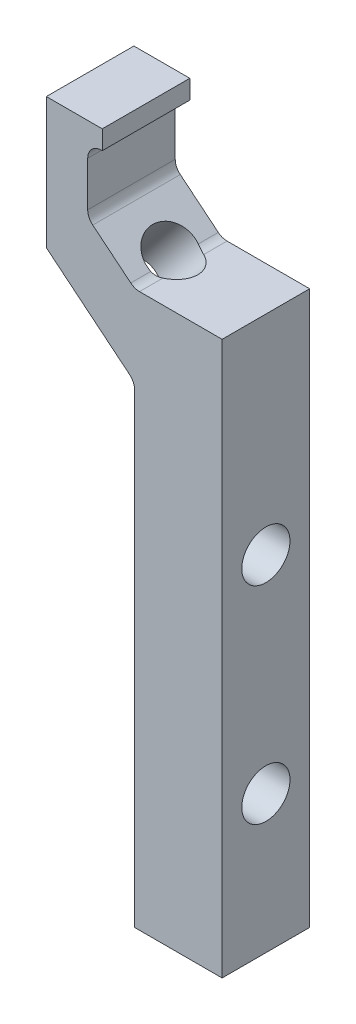
ISO-10303-21;
HEADER;
FILE_DESCRIPTION(('STEP AP214'),'2;1');
FILE_NAME('part.step','',(''),(''),'','','');
FILE_SCHEMA(('AUTOMOTIVE_DESIGN { 1 0 10303 214 1 1 1 1 }'));
ENDSEC;
DATA;
#1=APPLICATION_CONTEXT('core data for automotive mechanical design processes');
#2=APPLICATION_PROTOCOL_DEFINITION('international standard','automotive_design',2000,#1);
#3=PRODUCT_CONTEXT('',#1,'mechanical');
#4=PRODUCT('Part','Part','',(#3));
#5=PRODUCT_RELATED_PRODUCT_CATEGORY('part','',(#4));
#6=PRODUCT_DEFINITION_FORMATION('','',#4);
#7=PRODUCT_DEFINITION_CONTEXT('part definition',#1,'design');
#8=PRODUCT_DEFINITION('design','',#6,#7);
#9=PRODUCT_DEFINITION_SHAPE('','',#8);
#10=(LENGTH_UNIT() NAMED_UNIT(*) SI_UNIT(.MILLI.,.METRE.));
#11=(NAMED_UNIT(*) PLANE_ANGLE_UNIT() SI_UNIT($,.RADIAN.));
#12=(NAMED_UNIT(*) SI_UNIT($,.STERADIAN.) SOLID_ANGLE_UNIT());
#13=UNCERTAINTY_MEASURE_WITH_UNIT(LENGTH_MEASURE(1.E-05),#10,'distance_accuracy_value','');
#14=(GEOMETRIC_REPRESENTATION_CONTEXT(3) GLOBAL_UNCERTAINTY_ASSIGNED_CONTEXT((#13)) GLOBAL_UNIT_ASSIGNED_CONTEXT((#10,
#11,#12)) REPRESENTATION_CONTEXT('',''));
#15=CARTESIAN_POINT('',(0.,0.,0.));
#16=DIRECTION('',(0.,0.,1.));
#17=DIRECTION('',(1.,0.,0.));
#18=AXIS2_PLACEMENT_3D('',#15,#16,#17);
#19=CARTESIAN_POINT('',(-311.985474590838,82.2494022977564,12.7));
#20=DIRECTION('',(0.,0.,-1.));
#21=DIRECTION('',(-1.,0.,0.));
#22=AXIS2_PLACEMENT_3D('',#19,#20,#21);
#23=CYLINDRICAL_SURFACE('',#22,2.00000000000006);
#24=DIRECTION('',(0.,0.,-1.));
#25=VECTOR('',#24,1.);
#26=CARTESIAN_POINT('',(-313.252771845578,80.7021603424924,12.7));
#27=LINE('',#26,#25);
#28=CARTESIAN_POINT('',(-313.252771845578,80.7021603424922,2.90127585055652));
#29=VERTEX_POINT('',#28);
#30=CARTESIAN_POINT('',(-313.252771845578,80.7021603424924,0.));
#31=VERTEX_POINT('',#30);
#32=EDGE_CURVE('E247',#29,#31,#27,.T.);
#33=ORIENTED_EDGE('',*,*,#32,.F.);
#34=CARTESIAN_POINT('',(-313.252771845578,80.7021603424924,2.90127585055652));
#35=CARTESIAN_POINT('',(-313.21047379778,80.6675036747867,2.9107286558301));
#36=CARTESIAN_POINT('',(-313.166933552288,80.6347510794775,2.92150155180099));
#37=CARTESIAN_POINT('',(-313.077840684449,80.5731995785283,2.94551662128059));
#38=CARTESIAN_POINT('',(-313.032289738325,80.5443974588819,2.95875676656159));
#39=CARTESIAN_POINT('',(-312.939804176111,80.4909666793575,2.98748082182517));
#40=CARTESIAN_POINT('',(-312.89287744185,80.4663182437028,3.00295340887346));
#41=CARTESIAN_POINT('',(-312.797829766198,80.4210555644988,3.03597015881526));
#42=CARTESIAN_POINT('',(-312.749708644171,80.4004419354076,3.0535146365844));
#43=CARTESIAN_POINT('',(-312.60443888801,80.3447758912749,3.10877315240616));
#44=CARTESIAN_POINT('',(-312.505999579809,80.3156798355097,3.14923354542105));
#45=CARTESIAN_POINT('',(-312.308115917142,80.2730006489636,3.23534179277024));
#46=CARTESIAN_POINT('',(-312.208671595477,80.2594170135301,3.28098947829752));
#47=CARTESIAN_POINT('',(-312.088847324805,80.2519676119962,3.33791059609514));
#48=CARTESIAN_POINT('',(-312.068129838837,80.2510036260796,3.34782189679701));
#49=CARTESIAN_POINT('',(-312.026761118197,80.249721625733,3.36773496305563));
#50=CARTESIAN_POINT('',(-312.006109830682,80.2494025313598,3.37773654915213));
#51=CARTESIAN_POINT('',(-311.985474590838,80.2494022977563,3.38778280526414));
#52=B_SPLINE_CURVE_WITH_KNOTS('',3,(#34,#35,#36,#37,#38,#39,#40,#41,#42,#43,#44,#45,#46,#47,#48,
#49,#50,#51),.UNSPECIFIED.,.F.,.F.,(4,2,2,2,2,2,2,2,4),(0.,0.166394118839771,0.332652050327008,
0.498094576074735,0.663562277388514,0.99313956584748,1.32270613213646,1.39166154313553,
1.46050138456007),.UNSPECIFIED.);
#53=CARTESIAN_POINT('',(-311.985474590838,80.2494022977563,3.38778280526413));
#54=VERTEX_POINT('',#53);
#55=EDGE_CURVE('E50',#29,#54,#52,.T.);
#56=ORIENTED_EDGE('',*,*,#55,.T.);
#57=DIRECTION('',(0.,0.,-1.));
#58=VECTOR('',#57,1.);
#59=CARTESIAN_POINT('',(-311.985474590838,80.2494022977563,12.7));
#60=LINE('',#59,#58);
#61=CARTESIAN_POINT('',(-311.985474590838,80.2494022977563,0.));
#62=VERTEX_POINT('',#61);
#63=EDGE_CURVE('E251',#54,#62,#60,.T.);
#64=ORIENTED_EDGE('',*,*,#63,.T.);
#65=CARTESIAN_POINT('',(-311.985474590838,82.2494022977564,0.));
#66=DIRECTION('',(0.,0.,-1.));
#67=DIRECTION('',(-1.,0.,0.));
#68=AXIS2_PLACEMENT_3D('',#65,#66,#67);
#69=CIRCLE('',#68,2.00000000000006);
#70=EDGE_CURVE('E191',#62,#31,#69,.T.);
#71=ORIENTED_EDGE('',*,*,#70,.T.);
#72=EDGE_LOOP('',(#33,#56,#64,#71));
#73=FACE_BOUND('',#72,.T.);
#74=ADVANCED_FACE('F33',(#73),#23,.F.);
#75=CARTESIAN_POINT('',(-300.,0.,12.7));
#76=DIRECTION('',(-1.,0.,0.));
#77=DIRECTION('',(0.,0.,1.));
#78=AXIS2_PLACEMENT_3D('',#75,#76,#77);
#79=PLANE('',#78);
#80=CARTESIAN_POINT('',(-300.,50.,6.35));
#81=DIRECTION('',(-1.,0.,0.));
#82=DIRECTION('',(0.,0.,1.));
#83=AXIS2_PLACEMENT_3D('',#80,#81,#82);
#84=CIRCLE('',#83,3.5);
#85=CARTESIAN_POINT('',(-300.,50.,9.85));
#86=VERTEX_POINT('',#85);
#87=EDGE_CURVE('E255',#86,#86,#84,.T.);
#88=ORIENTED_EDGE('',*,*,#87,.T.);
#89=EDGE_LOOP('',(#88));
#90=FACE_BOUND('',#89,.T.);
#91=CARTESIAN_POINT('',(-300.,20.,6.35));
#92=DIRECTION('',(-1.,0.,0.));
#93=DIRECTION('',(0.,0.,1.));
#94=AXIS2_PLACEMENT_3D('',#91,#92,#93);
#95=CIRCLE('',#94,3.5);
#96=CARTESIAN_POINT('',(-300.,20.,9.85));
#97=VERTEX_POINT('',#96);
#98=EDGE_CURVE('E260',#97,#97,#95,.T.);
#99=ORIENTED_EDGE('',*,*,#98,.T.);
#100=EDGE_LOOP('',(#99));
#101=FACE_BOUND('',#100,.T.);
#102=DIRECTION('',(0.,1.,0.));
#103=VECTOR('',#102,1.);
#104=CARTESIAN_POINT('',(-300.,0.,0.));
#105=LINE('',#104,#103);
#106=CARTESIAN_POINT('',(-300.,0.,0.));
#107=VERTEX_POINT('',#106);
#108=CARTESIAN_POINT('',(-300.,80.2494022977564,0.));
#109=VERTEX_POINT('',#108);
#110=EDGE_CURVE('E185',#107,#109,#105,.T.);
#111=ORIENTED_EDGE('',*,*,#110,.T.);
#112=DIRECTION('',(0.,0.,-1.));
#113=VECTOR('',#112,1.);
#114=CARTESIAN_POINT('',(-300.,80.2494022977564,12.7));
#115=LINE('',#114,#113);
#116=CARTESIAN_POINT('',(-300.,80.2494022977564,12.7));
#117=VERTEX_POINT('',#116);
#118=EDGE_CURVE('E11',#117,#109,#115,.T.);
#119=ORIENTED_EDGE('',*,*,#118,.F.);
#120=DIRECTION('',(0.,1.,0.));
#121=VECTOR('',#120,1.);
#122=CARTESIAN_POINT('',(-300.,0.,12.7));
#123=LINE('',#122,#121);
#124=CARTESIAN_POINT('',(-300.,0.,12.7));
#125=VERTEX_POINT('',#124);
#126=EDGE_CURVE('E219',#125,#117,#123,.T.);
#127=ORIENTED_EDGE('',*,*,#126,.F.);
#128=DIRECTION('',(0.,0.,-1.));
#129=VECTOR('',#128,1.);
#130=CARTESIAN_POINT('',(-300.,0.,12.7));
#131=LINE('',#130,#129);
#132=EDGE_CURVE('E181',#125,#107,#131,.T.);
#133=ORIENTED_EDGE('',*,*,#132,.T.);
#134=EDGE_LOOP('',(#111,#119,#127,#133));
#135=FACE_BOUND('',#134,.T.);
#136=ADVANCED_FACE('F35',(#90,#101,#135),#79,.F.);
#137=CARTESIAN_POINT('',(-311.985474590838,80.2494022977563,12.7));
#138=DIRECTION('',(0.,-1.,0.));
#139=DIRECTION('',(1.,0.,0.));
#140=AXIS2_PLACEMENT_3D('',#137,#138,#139);
#141=PLANE('',#140);
#142=ORIENTED_EDGE('',*,*,#63,.F.);
#143=CARTESIAN_POINT('',(-314.395191325855,80.2494022977563,6.35));
#144=DIRECTION('',(0.,-1.,0.));
#145=DIRECTION('',(-1.,0.,0.));
#146=AXIS2_PLACEMENT_3D('',#143,#144,#145);
#147=ELLIPSE('',#146,4.52417928313357,3.49999999999997);
#148=CARTESIAN_POINT('',(-311.985474590838,80.2494022977563,9.31221719473586));
#149=VERTEX_POINT('',#148);
#150=EDGE_CURVE('E265',#54,#149,#147,.T.);
#151=ORIENTED_EDGE('',*,*,#150,.T.);
#152=CARTESIAN_POINT('',(-311.985474590838,80.2494022977563,12.7));
#153=VERTEX_POINT('',#152);
#154=EDGE_CURVE('E42',#153,#149,#60,.T.);
#155=ORIENTED_EDGE('',*,*,#154,.F.);
#156=DIRECTION('',(-1.,0.,0.));
#157=VECTOR('',#156,1.);
#158=CARTESIAN_POINT('',(-311.985474590838,80.2494022977563,12.7));
#159=LINE('',#158,#157);
#160=EDGE_CURVE('E121',#117,#153,#159,.T.);
#161=ORIENTED_EDGE('',*,*,#160,.F.);
#162=ORIENTED_EDGE('',*,*,#118,.T.);
#163=DIRECTION('',(-1.,0.,0.));
#164=VECTOR('',#163,1.);
#165=CARTESIAN_POINT('',(-311.985474590838,80.2494022977563,0.));
#166=LINE('',#165,#164);
#167=EDGE_CURVE('E188',#109,#62,#166,.T.);
#168=ORIENTED_EDGE('',*,*,#167,.T.);
#169=EDGE_LOOP('',(#142,#151,#155,#161,#162,#168));
#170=FACE_BOUND('',#169,.T.);
#171=ADVANCED_FACE('F309',(#170),#141,.F.);
#172=ORIENTED_EDGE('',*,*,#154,.T.);
#173=CARTESIAN_POINT('',(-311.985474590838,80.2494022977563,9.31221719473586));
#174=CARTESIAN_POINT('',(-312.041345873165,80.2494147062884,9.33942193889383));
#175=CARTESIAN_POINT('',(-312.097346264366,80.2517459726687,9.36629428141184));
#176=CARTESIAN_POINT('',(-312.209474534102,80.2611847807516,9.41901463518755));
#177=CARTESIAN_POINT('',(-312.265602476341,80.2682958585293,9.44486187307646));
#178=CARTESIAN_POINT('',(-312.430312393308,80.2963972499135,9.51867734425083));
#179=CARTESIAN_POINT('',(-312.538775362348,80.3241489948017,9.56468494702035));
#180=CARTESIAN_POINT('',(-312.698238094315,80.3798813014685,9.62719653256676));
#181=CARTESIAN_POINT('',(-312.750612777069,80.4006780233543,9.64687221529022));
#182=CARTESIAN_POINT('',(-312.854103169602,80.4469889194061,9.68388686690297));
#183=CARTESIAN_POINT('',(-312.905219096785,80.4725022723798,9.70122624164963));
#184=CARTESIAN_POINT('',(-313.007241934892,80.5290841931396,9.73376998464595));
#185=CARTESIAN_POINT('',(-313.05809384573,80.5602997436646,9.74889207741884));
#186=CARTESIAN_POINT('',(-313.157398540601,80.6276098305598,9.77612965190211));
#187=CARTESIAN_POINT('',(-313.205848486627,80.6637099589458,9.78824164179714));
#188=CARTESIAN_POINT('',(-313.252771845578,80.7021603424924,9.79872414944348));
#189=B_SPLINE_CURVE_WITH_KNOTS('',3,(#173,#174,#175,#176,#177,#178,#179,#180,#181,#182,#183,
#184,#185,#186,#187,#188),.UNSPECIFIED.,.F.,.F.,(4,2,2,2,2,2,2,4),(0.,0.18631669785167,
0.372771383580051,0.733898179126107,0.91277229164198,1.09161529043684,1.27597047512295,
1.46053852981819),.UNSPECIFIED.);
#190=CARTESIAN_POINT('',(-313.252771845578,80.7021603424922,9.79872414944348));
#191=VERTEX_POINT('',#190);
#192=EDGE_CURVE('E317',#149,#191,#189,.T.);
#193=ORIENTED_EDGE('',*,*,#192,.T.);
#194=CARTESIAN_POINT('',(-313.252771845578,80.7021603424924,12.7));
#195=VERTEX_POINT('',#194);
#196=EDGE_CURVE('E248',#195,#191,#27,.T.);
#197=ORIENTED_EDGE('',*,*,#196,.F.);
#198=CARTESIAN_POINT('',(-311.985474590838,82.2494022977564,12.7));
#199=DIRECTION('',(0.,0.,-1.));
#200=DIRECTION('',(-1.,0.,0.));
#201=AXIS2_PLACEMENT_3D('',#198,#199,#200);
#202=CIRCLE('',#201,2.00000000000006);
#203=EDGE_CURVE('E272',#153,#195,#202,.T.);
#204=ORIENTED_EDGE('',*,*,#203,.F.);
#205=EDGE_LOOP('',(#172,#193,#197,#204));
#206=FACE_BOUND('',#205,.T.);
#207=ADVANCED_FACE('F313',(#206),#23,.F.);
#208=CARTESIAN_POINT('',(-318.5,84.9999999999999,12.7));
#209=DIRECTION('',(-0.633648627369973,-0.773620977631908,0.));
#210=DIRECTION('',(0.773620977631908,-0.633648627369973,0.));
#211=AXIS2_PLACEMENT_3D('',#208,#209,#210);
#212=PLANE('',#211);
#213=ORIENTED_EDGE('',*,*,#196,.T.);
#214=CARTESIAN_POINT('',(-313.714554068369,81.0803916470659,6.35));
#215=DIRECTION('',(-0.633648627369973,-0.773620977631908,0.));
#216=DIRECTION('',(0.773620977631908,-0.633648627369973,0.));
#217=AXIS2_PLACEMENT_3D('',#214,#215,#216);
#218=CIRCLE('',#217,3.49999999999997);
#219=EDGE_CURVE('E352',#191,#29,#218,.T.);
#220=ORIENTED_EDGE('',*,*,#219,.T.);
#221=ORIENTED_EDGE('',*,*,#32,.T.);
#222=DIRECTION('',(-0.773620977631908,0.633648627369973,0.));
#223=VECTOR('',#222,1.);
#224=CARTESIAN_POINT('',(-318.5,84.9999999999999,0.));
#225=LINE('',#224,#223);
#226=CARTESIAN_POINT('',(-318.76729725474,85.2189347800315,0.));
#227=VERTEX_POINT('',#226);
#228=EDGE_CURVE('E194',#31,#227,#225,.T.);
#229=ORIENTED_EDGE('',*,*,#228,.T.);
#230=DIRECTION('',(0.,0.,-1.));
#231=VECTOR('',#230,1.);
#232=CARTESIAN_POINT('',(-318.76729725474,85.2189347800315,12.7));
#233=LINE('',#232,#231);
#234=CARTESIAN_POINT('',(-318.76729725474,85.2189347800315,12.7));
#235=VERTEX_POINT('',#234);
#236=EDGE_CURVE('E244',#235,#227,#233,.T.);
#237=ORIENTED_EDGE('',*,*,#236,.F.);
#238=DIRECTION('',(-0.773620977631945,0.633648627369929,0.));
#239=VECTOR('',#238,1.);
#240=CARTESIAN_POINT('',(-317.170141731204,83.910754890336,12.7));
#241=LINE('',#240,#239);
#242=EDGE_CURVE('E274',#195,#235,#241,.T.);
#243=ORIENTED_EDGE('',*,*,#242,.F.);
#244=EDGE_LOOP('',(#213,#220,#221,#229,#237,#243));
#245=FACE_BOUND('',#244,.T.);
#246=ADVANCED_FACE('F320',(#245),#212,.F.);
#247=CARTESIAN_POINT('',(-317.5,86.7661767352953,12.7));
#248=DIRECTION('',(0.,0.,-1.));
#249=DIRECTION('',(-1.,0.,0.));
#250=AXIS2_PLACEMENT_3D('',#247,#248,#249);
#251=CYLINDRICAL_SURFACE('',#250,1.99999999999999);
#252=CARTESIAN_POINT('',(-317.5,86.7661767352953,0.));
#253=DIRECTION('',(0.,0.,-1.));
#254=DIRECTION('',(-1.,0.,0.));
#255=AXIS2_PLACEMENT_3D('',#252,#253,#254);
#256=CIRCLE('',#255,1.99999999999999);
#257=CARTESIAN_POINT('',(-319.5,86.7661767352953,0.));
#258=VERTEX_POINT('',#257);
#259=EDGE_CURVE('E196',#227,#258,#256,.T.);
#260=ORIENTED_EDGE('',*,*,#259,.T.);
#261=DIRECTION('',(0.,0.,-1.));
#262=VECTOR('',#261,1.);
#263=CARTESIAN_POINT('',(-319.5,86.7661767352953,12.7));
#264=LINE('',#263,#262);
#265=CARTESIAN_POINT('',(-319.5,86.7661767352953,12.7));
#266=VERTEX_POINT('',#265);
#267=EDGE_CURVE('E241',#266,#258,#264,.T.);
#268=ORIENTED_EDGE('',*,*,#267,.F.);
#269=CARTESIAN_POINT('',(-317.5,86.7661767352953,12.7));
#270=DIRECTION('',(0.,0.,-1.));
#271=DIRECTION('',(-1.,0.,0.));
#272=AXIS2_PLACEMENT_3D('',#269,#270,#271);
#273=CIRCLE('',#272,1.99999999999999);
#274=EDGE_CURVE('E276',#235,#266,#273,.T.);
#275=ORIENTED_EDGE('',*,*,#274,.F.);
#276=ORIENTED_EDGE('',*,*,#236,.T.);
#277=EDGE_LOOP('',(#260,#268,#275,#276));
#278=FACE_BOUND('',#277,.T.);
#279=ADVANCED_FACE('F326',(#278),#251,.F.);
#280=CARTESIAN_POINT('',(-319.5,93.25,12.7));
#281=DIRECTION('',(-1.,0.,0.));
#282=DIRECTION('',(0.,0.,1.));
#283=AXIS2_PLACEMENT_3D('',#280,#281,#282);
#284=PLANE('',#283);
#285=DIRECTION('',(0.,1.,0.));
#286=VECTOR('',#285,1.);
#287=CARTESIAN_POINT('',(-319.5,93.25,0.));
#288=LINE('',#287,#286);
#289=CARTESIAN_POINT('',(-319.5,93.25,0.));
#290=VERTEX_POINT('',#289);
#291=EDGE_CURVE('E198',#258,#290,#288,.T.);
#292=ORIENTED_EDGE('',*,*,#291,.T.);
#293=DIRECTION('',(0.,0.,-1.));
#294=VECTOR('',#293,1.);
#295=CARTESIAN_POINT('',(-319.5,93.25,12.7));
#296=LINE('',#295,#294);
#297=CARTESIAN_POINT('',(-319.5,93.25,12.7));
#298=VERTEX_POINT('',#297);
#299=EDGE_CURVE('E238',#298,#290,#296,.T.);
#300=ORIENTED_EDGE('',*,*,#299,.F.);
#301=DIRECTION('',(0.,1.,0.));
#302=VECTOR('',#301,1.);
#303=CARTESIAN_POINT('',(-319.5,93.25,12.7));
#304=LINE('',#303,#302);
#305=EDGE_CURVE('E278',#266,#298,#304,.T.);
#306=ORIENTED_EDGE('',*,*,#305,.F.);
#307=ORIENTED_EDGE('',*,*,#267,.T.);
#308=EDGE_LOOP('',(#292,#300,#306,#307));
#309=FACE_BOUND('',#308,.T.);
#310=ADVANCED_FACE('F330',(#309),#284,.F.);
#311=CARTESIAN_POINT('',(-317.5,93.25,12.7));
#312=DIRECTION('',(0.,0.,-1.));
#313=DIRECTION('',(-1.,0.,0.));
#314=AXIS2_PLACEMENT_3D('',#311,#312,#313);
#315=CYLINDRICAL_SURFACE('',#314,2.);
#316=CARTESIAN_POINT('',(-317.5,93.25,0.));
#317=DIRECTION('',(0.,0.,-1.));
#318=DIRECTION('',(1.,0.,0.));
#319=AXIS2_PLACEMENT_3D('',#316,#317,#318);
#320=CIRCLE('',#319,2.);
#321=CARTESIAN_POINT('',(-317.5,95.25,0.));
#322=VERTEX_POINT('',#321);
#323=EDGE_CURVE('E200',#290,#322,#320,.T.);
#324=ORIENTED_EDGE('',*,*,#323,.T.);
#325=DIRECTION('',(0.,0.,-1.));
#326=VECTOR('',#325,1.);
#327=CARTESIAN_POINT('',(-317.5,95.25,12.7));
#328=LINE('',#327,#326);
#329=CARTESIAN_POINT('',(-317.5,95.25,12.7));
#330=VERTEX_POINT('',#329);
#331=EDGE_CURVE('E235',#330,#322,#328,.T.);
#332=ORIENTED_EDGE('',*,*,#331,.F.);
#333=CARTESIAN_POINT('',(-317.5,93.25,12.7));
#334=DIRECTION('',(0.,0.,-1.));
#335=DIRECTION('',(1.,0.,0.));
#336=AXIS2_PLACEMENT_3D('',#333,#334,#335);
#337=CIRCLE('',#336,2.);
#338=EDGE_CURVE('E280',#298,#330,#337,.T.);
#339=ORIENTED_EDGE('',*,*,#338,.F.);
#340=ORIENTED_EDGE('',*,*,#299,.T.);
#341=EDGE_LOOP('',(#324,#332,#339,#340));
#342=FACE_BOUND('',#341,.T.);
#343=ADVANCED_FACE('F335',(#342),#315,.F.);
#344=CARTESIAN_POINT('',(-317.5,95.25,12.7));
#345=DIRECTION('',(0.,1.,0.));
#346=DIRECTION('',(0.,0.,1.));
#347=AXIS2_PLACEMENT_3D('',#344,#345,#346);
#348=PLANE('',#347);
#349=DIRECTION('',(1.,0.,0.));
#350=VECTOR('',#349,1.);
#351=CARTESIAN_POINT('',(-317.5,95.25,0.));
#352=LINE('',#351,#350);
#353=CARTESIAN_POINT('',(-317.388555410704,95.25,0.));
#354=VERTEX_POINT('',#353);
#355=EDGE_CURVE('E202',#322,#354,#352,.T.);
#356=ORIENTED_EDGE('',*,*,#355,.T.);
#357=DIRECTION('',(0.,0.,-1.));
#358=VECTOR('',#357,1.);
#359=CARTESIAN_POINT('',(-317.388555410704,95.25,12.7));
#360=LINE('',#359,#358);
#361=CARTESIAN_POINT('',(-317.388555410704,95.25,12.7));
#362=VERTEX_POINT('',#361);
#363=EDGE_CURVE('E232',#362,#354,#360,.T.);
#364=ORIENTED_EDGE('',*,*,#363,.F.);
#365=DIRECTION('',(1.,0.,0.));
#366=VECTOR('',#365,1.);
#367=CARTESIAN_POINT('',(-317.5,95.25,12.7));
#368=LINE('',#367,#366);
#369=EDGE_CURVE('E282',#330,#362,#368,.T.);
#370=ORIENTED_EDGE('',*,*,#369,.F.);
#371=ORIENTED_EDGE('',*,*,#331,.T.);
#372=EDGE_LOOP('',(#356,#364,#370,#371));
#373=FACE_BOUND('',#372,.T.);
#374=ADVANCED_FACE('F341',(#373),#348,.F.);
#375=CARTESIAN_POINT('',(-317.388555410704,98.,12.7));
#376=DIRECTION('',(-1.,0.,0.));
#377=DIRECTION('',(0.,0.,1.));
#378=AXIS2_PLACEMENT_3D('',#375,#376,#377);
#379=PLANE('',#378);
#380=DIRECTION('',(0.,1.,0.));
#381=VECTOR('',#380,1.);
#382=CARTESIAN_POINT('',(-317.388555410704,98.,0.));
#383=LINE('',#382,#381);
#384=CARTESIAN_POINT('',(-317.388555410704,98.,0.));
#385=VERTEX_POINT('',#384);
#386=EDGE_CURVE('E205',#354,#385,#383,.T.);
#387=ORIENTED_EDGE('',*,*,#386,.T.);
#388=DIRECTION('',(0.,0.,-1.));
#389=VECTOR('',#388,1.);
#390=CARTESIAN_POINT('',(-317.388555410704,98.,12.7));
#391=LINE('',#390,#389);
#392=CARTESIAN_POINT('',(-317.388555410704,98.,12.7));
#393=VERTEX_POINT('',#392);
#394=EDGE_CURVE('E229',#393,#385,#391,.T.);
#395=ORIENTED_EDGE('',*,*,#394,.F.);
#396=DIRECTION('',(0.,1.,0.));
#397=VECTOR('',#396,1.);
#398=CARTESIAN_POINT('',(-317.388555410704,96.25,12.7));
#399=LINE('',#398,#397);
#400=EDGE_CURVE('E284',#362,#393,#399,.T.);
#401=ORIENTED_EDGE('',*,*,#400,.F.);
#402=ORIENTED_EDGE('',*,*,#363,.T.);
#403=EDGE_LOOP('',(#387,#395,#401,#402));
#404=FACE_BOUND('',#403,.T.);
#405=ADVANCED_FACE('F344',(#404),#379,.F.);
#406=CARTESIAN_POINT('',(-318.5,98.,12.7));
#407=DIRECTION('',(0.,-1.,0.));
#408=DIRECTION('',(0.,0.,-1.));
#409=AXIS2_PLACEMENT_3D('',#406,#407,#408);
#410=PLANE('',#409);
#411=DIRECTION('',(-1.,0.,0.));
#412=VECTOR('',#411,1.);
#413=CARTESIAN_POINT('',(-318.5,98.,0.));
#414=LINE('',#413,#412);
#415=CARTESIAN_POINT('',(-325.5,98.,0.));
#416=VERTEX_POINT('',#415);
#417=EDGE_CURVE('E208',#385,#416,#414,.T.);
#418=ORIENTED_EDGE('',*,*,#417,.T.);
#419=DIRECTION('',(0.,0.,-1.));
#420=VECTOR('',#419,1.);
#421=CARTESIAN_POINT('',(-325.5,98.,12.7));
#422=LINE('',#421,#420);
#423=CARTESIAN_POINT('',(-325.5,98.,12.7));
#424=VERTEX_POINT('',#423);
#425=EDGE_CURVE('E226',#424,#416,#422,.T.);
#426=ORIENTED_EDGE('',*,*,#425,.F.);
#427=DIRECTION('',(-1.,0.,0.));
#428=VECTOR('',#427,1.);
#429=CARTESIAN_POINT('',(-317.388555410704,98.,12.7));
#430=LINE('',#429,#428);
#431=EDGE_CURVE('E286',#393,#424,#430,.T.);
#432=ORIENTED_EDGE('',*,*,#431,.F.);
#433=ORIENTED_EDGE('',*,*,#394,.T.);
#434=EDGE_LOOP('',(#418,#426,#432,#433));
#435=FACE_BOUND('',#434,.T.);
#436=ADVANCED_FACE('F346',(#435),#410,.F.);
#437=CARTESIAN_POINT('',(-325.5,81.9999999999998,12.7));
#438=DIRECTION('',(1.,0.,0.));
#439=DIRECTION('',(0.,0.,-1.));
#440=AXIS2_PLACEMENT_3D('',#437,#438,#439);
#441=PLANE('',#440);
#442=DIRECTION('',(0.,-1.,0.));
#443=VECTOR('',#442,1.);
#444=CARTESIAN_POINT('',(-325.5,81.9999999999998,0.));
#445=LINE('',#444,#443);
#446=CARTESIAN_POINT('',(-325.5,78.9999999999998,0.));
#447=VERTEX_POINT('',#446);
#448=EDGE_CURVE('E211',#416,#447,#445,.T.);
#449=ORIENTED_EDGE('',*,*,#448,.T.);
#450=DIRECTION('',(0.,0.,-1.));
#451=VECTOR('',#450,1.);
#452=CARTESIAN_POINT('',(-325.5,78.9999999999998,12.7));
#453=LINE('',#452,#451);
#454=CARTESIAN_POINT('',(-325.5,78.9999999999998,12.7));
#455=VERTEX_POINT('',#454);
#456=EDGE_CURVE('E223',#455,#447,#453,.T.);
#457=ORIENTED_EDGE('',*,*,#456,.F.);
#458=DIRECTION('',(0.,-1.,0.));
#459=VECTOR('',#458,1.);
#460=CARTESIAN_POINT('',(-325.5,98.,12.7));
#461=LINE('',#460,#459);
#462=EDGE_CURVE('E288',#424,#455,#461,.T.);
#463=ORIENTED_EDGE('',*,*,#462,.F.);
#464=ORIENTED_EDGE('',*,*,#425,.T.);
#465=EDGE_LOOP('',(#449,#457,#463,#464));
#466=FACE_BOUND('',#465,.T.);
#467=ADVANCED_FACE('F294',(#466),#441,.F.);
#468=CARTESIAN_POINT('',(-325.5,78.9999999999998,12.7));
#469=DIRECTION('',(0.633648627369929,0.773620977631944,0.));
#470=DIRECTION('',(-0.773620977631944,0.633648627369929,0.));
#471=AXIS2_PLACEMENT_3D('',#468,#469,#470);
#472=PLANE('',#471);
#473=CARTESIAN_POINT('',(-319.46635137263,74.0580280508053,6.35));
#474=DIRECTION('',(-0.633648627369929,-0.773620977631944,0.));
#475=DIRECTION('',(0.773620977631944,-0.633648627369929,0.));
#476=AXIS2_PLACEMENT_3D('',#473,#474,#475);
#477=CIRCLE('',#476,3.49999999999997);
#478=CARTESIAN_POINT('',(-316.758677950918,71.8402578550105,6.35));
#479=VERTEX_POINT('',#478);
#480=EDGE_CURVE('E354',#479,#479,#477,.T.);
#481=ORIENTED_EDGE('',*,*,#480,.F.);
#482=EDGE_LOOP('',(#481));
#483=FACE_BOUND('',#482,.T.);
#484=DIRECTION('',(0.773620977631944,-0.633648627369929,0.));
#485=VECTOR('',#484,1.);
#486=CARTESIAN_POINT('',(-325.5,78.9999999999998,0.));
#487=LINE('',#486,#485);
#488=CARTESIAN_POINT('',(-313.43270274526,69.1160561016108,0.));
#489=VERTEX_POINT('',#488);
#490=EDGE_CURVE('E213',#447,#489,#487,.T.);
#491=ORIENTED_EDGE('',*,*,#490,.T.);
#492=DIRECTION('',(0.,0.,-1.));
#493=VECTOR('',#492,1.);
#494=CARTESIAN_POINT('',(-313.43270274526,69.1160561016108,12.7));
#495=LINE('',#494,#493);
#496=CARTESIAN_POINT('',(-313.43270274526,69.1160561016108,12.7));
#497=VERTEX_POINT('',#496);
#498=EDGE_CURVE('E176',#497,#489,#495,.T.);
#499=ORIENTED_EDGE('',*,*,#498,.F.);
#500=DIRECTION('',(0.773620977631944,-0.633648627369929,0.));
#501=VECTOR('',#500,1.);
#502=CARTESIAN_POINT('',(-325.5,78.9999999999998,12.7));
#503=LINE('',#502,#501);
#504=EDGE_CURVE('E164',#455,#497,#503,.T.);
#505=ORIENTED_EDGE('',*,*,#504,.F.);
#506=ORIENTED_EDGE('',*,*,#456,.T.);
#507=EDGE_LOOP('',(#491,#499,#505,#506));
#508=FACE_BOUND('',#507,.T.);
#509=ADVANCED_FACE('F297',(#483,#508),#472,.F.);
#510=CARTESIAN_POINT('',(-314.7,67.5688141463469,12.7));
#511=DIRECTION('',(0.,0.,-1.));
#512=DIRECTION('',(-1.,0.,0.));
#513=AXIS2_PLACEMENT_3D('',#510,#511,#512);
#514=CYLINDRICAL_SURFACE('',#513,2.);
#515=CARTESIAN_POINT('',(-314.7,67.5688141463469,0.));
#516=DIRECTION('',(0.,0.,-1.));
#517=DIRECTION('',(1.,0.,0.));
#518=AXIS2_PLACEMENT_3D('',#515,#516,#517);
#519=CIRCLE('',#518,2.);
#520=CARTESIAN_POINT('',(-312.7,67.5688141463469,0.));
#521=VERTEX_POINT('',#520);
#522=EDGE_CURVE('E174',#489,#521,#519,.T.);
#523=ORIENTED_EDGE('',*,*,#522,.T.);
#524=DIRECTION('',(0.,0.,-1.));
#525=VECTOR('',#524,1.);
#526=CARTESIAN_POINT('',(-312.7,67.5688141463469,12.7));
#527=LINE('',#526,#525);
#528=CARTESIAN_POINT('',(-312.7,67.5688141463469,12.7));
#529=VERTEX_POINT('',#528);
#530=EDGE_CURVE('E171',#529,#521,#527,.T.);
#531=ORIENTED_EDGE('',*,*,#530,.F.);
#532=CARTESIAN_POINT('',(-314.7,67.5688141463469,12.7));
#533=DIRECTION('',(0.,0.,-1.));
#534=DIRECTION('',(1.,0.,0.));
#535=AXIS2_PLACEMENT_3D('',#532,#533,#534);
#536=CIRCLE('',#535,2.);
#537=EDGE_CURVE('E157',#497,#529,#536,.T.);
#538=ORIENTED_EDGE('',*,*,#537,.F.);
#539=ORIENTED_EDGE('',*,*,#498,.T.);
#540=EDGE_LOOP('',(#523,#531,#538,#539));
#541=FACE_BOUND('',#540,.T.);
#542=ADVANCED_FACE('F172',(#541),#514,.F.);
#543=CARTESIAN_POINT('',(-312.7,60.2999999999999,12.7));
#544=DIRECTION('',(1.,0.,0.));
#545=DIRECTION('',(0.,0.,-1.));
#546=AXIS2_PLACEMENT_3D('',#543,#544,#545);
#547=PLANE('',#546);
#548=CARTESIAN_POINT('',(-312.7,50.,6.35));
#549=DIRECTION('',(1.,0.,0.));
#550=DIRECTION('',(0.,0.,-1.));
#551=AXIS2_PLACEMENT_3D('',#548,#549,#550);
#552=CIRCLE('',#551,3.5);
#553=CARTESIAN_POINT('',(-312.7,50.,2.85));
#554=VERTEX_POINT('',#553);
#555=EDGE_CURVE('E37',#554,#554,#552,.T.);
#556=ORIENTED_EDGE('',*,*,#555,.T.);
#557=EDGE_LOOP('',(#556));
#558=FACE_BOUND('',#557,.T.);
#559=CARTESIAN_POINT('',(-312.7,20.,6.35));
#560=DIRECTION('',(1.,0.,0.));
#561=DIRECTION('',(0.,0.,-1.));
#562=AXIS2_PLACEMENT_3D('',#559,#560,#561);
#563=CIRCLE('',#562,3.5);
#564=CARTESIAN_POINT('',(-312.7,20.,2.85));
#565=VERTEX_POINT('',#564);
#566=EDGE_CURVE('E253',#565,#565,#563,.T.);
#567=ORIENTED_EDGE('',*,*,#566,.T.);
#568=EDGE_LOOP('',(#567));
#569=FACE_BOUND('',#568,.T.);
#570=DIRECTION('',(0.,-1.,0.));
#571=VECTOR('',#570,1.);
#572=CARTESIAN_POINT('',(-312.7,60.2999999999999,0.));
#573=LINE('',#572,#571);
#574=CARTESIAN_POINT('',(-312.7,0.,0.));
#575=VERTEX_POINT('',#574);
#576=EDGE_CURVE('E216',#521,#575,#573,.T.);
#577=ORIENTED_EDGE('',*,*,#576,.T.);
#578=DIRECTION('',(0.,0.,-1.));
#579=VECTOR('',#578,1.);
#580=CARTESIAN_POINT('',(-312.7,0.,12.7));
#581=LINE('',#580,#579);
#582=CARTESIAN_POINT('',(-312.7,0.,12.7));
#583=VERTEX_POINT('',#582);
#584=EDGE_CURVE('E177',#583,#575,#581,.T.);
#585=ORIENTED_EDGE('',*,*,#584,.F.);
#586=DIRECTION('',(0.,-1.,0.));
#587=VECTOR('',#586,1.);
#588=CARTESIAN_POINT('',(-312.7,67.5688141463469,12.7));
#589=LINE('',#588,#587);
#590=EDGE_CURVE('E161',#529,#583,#589,.T.);
#591=ORIENTED_EDGE('',*,*,#590,.F.);
#592=ORIENTED_EDGE('',*,*,#530,.T.);
#593=EDGE_LOOP('',(#577,#585,#591,#592));
#594=FACE_BOUND('',#593,.T.);
#595=ADVANCED_FACE('F179',(#558,#569,#594),#547,.F.);
#596=CARTESIAN_POINT('',(-312.7,0.,12.7));
#597=DIRECTION('',(0.,1.,0.));
#598=DIRECTION('',(0.,0.,1.));
#599=AXIS2_PLACEMENT_3D('',#596,#597,#598);
#600=PLANE('',#599);
#601=DIRECTION('',(1.,0.,0.));
#602=VECTOR('',#601,1.);
#603=CARTESIAN_POINT('',(-312.7,0.,0.));
#604=LINE('',#603,#602);
#605=EDGE_CURVE('E113',#575,#107,#604,.T.);
#606=ORIENTED_EDGE('',*,*,#605,.T.);
#607=ORIENTED_EDGE('',*,*,#132,.F.);
#608=DIRECTION('',(1.,0.,0.));
#609=VECTOR('',#608,1.);
#610=CARTESIAN_POINT('',(-312.7,0.,12.7));
#611=LINE('',#610,#609);
#612=EDGE_CURVE('E59',#583,#125,#611,.T.);
#613=ORIENTED_EDGE('',*,*,#612,.F.);
#614=ORIENTED_EDGE('',*,*,#584,.T.);
#615=EDGE_LOOP('',(#606,#607,#613,#614));
#616=FACE_BOUND('',#615,.T.);
#617=ADVANCED_FACE('F301',(#616),#600,.F.);
#618=CARTESIAN_POINT('',(-311.985474590838,82.2494022977564,12.7));
#619=DIRECTION('',(0.,0.,-1.));
#620=DIRECTION('',(-1.,0.,0.));
#621=AXIS2_PLACEMENT_3D('',#618,#619,#620);
#622=PLANE('',#621);
#623=ORIENTED_EDGE('',*,*,#126,.T.);
#624=ORIENTED_EDGE('',*,*,#160,.T.);
#625=ORIENTED_EDGE('',*,*,#203,.T.);
#626=ORIENTED_EDGE('',*,*,#242,.T.);
#627=ORIENTED_EDGE('',*,*,#274,.T.);
#628=ORIENTED_EDGE('',*,*,#305,.T.);
#629=ORIENTED_EDGE('',*,*,#338,.T.);
#630=ORIENTED_EDGE('',*,*,#369,.T.);
#631=ORIENTED_EDGE('',*,*,#400,.T.);
#632=ORIENTED_EDGE('',*,*,#431,.T.);
#633=ORIENTED_EDGE('',*,*,#462,.T.);
#634=ORIENTED_EDGE('',*,*,#504,.T.);
#635=ORIENTED_EDGE('',*,*,#537,.T.);
#636=ORIENTED_EDGE('',*,*,#590,.T.);
#637=ORIENTED_EDGE('',*,*,#612,.T.);
#638=EDGE_LOOP('',(#623,#624,#625,#626,#627,#628,#629,#630,#631,#632,#633,#634,#635,#636,#637));
#639=FACE_BOUND('',#638,.T.);
#640=ADVANCED_FACE('F159',(#639),#622,.F.);
#641=CARTESIAN_POINT('',(-311.985474590838,82.2494022977564,0.));
#642=DIRECTION('',(0.,0.,-1.));
#643=DIRECTION('',(-1.,0.,0.));
#644=AXIS2_PLACEMENT_3D('',#641,#642,#643);
#645=PLANE('',#644);
#646=ORIENTED_EDGE('',*,*,#110,.F.);
#647=ORIENTED_EDGE('',*,*,#605,.F.);
#648=ORIENTED_EDGE('',*,*,#576,.F.);
#649=ORIENTED_EDGE('',*,*,#522,.F.);
#650=ORIENTED_EDGE('',*,*,#490,.F.);
#651=ORIENTED_EDGE('',*,*,#448,.F.);
#652=ORIENTED_EDGE('',*,*,#417,.F.);
#653=ORIENTED_EDGE('',*,*,#386,.F.);
#654=ORIENTED_EDGE('',*,*,#355,.F.);
#655=ORIENTED_EDGE('',*,*,#323,.F.);
#656=ORIENTED_EDGE('',*,*,#291,.F.);
#657=ORIENTED_EDGE('',*,*,#259,.F.);
#658=ORIENTED_EDGE('',*,*,#228,.F.);
#659=ORIENTED_EDGE('',*,*,#70,.F.);
#660=ORIENTED_EDGE('',*,*,#167,.F.);
#661=EDGE_LOOP('',(#646,#647,#648,#649,#650,#651,#652,#653,#654,#655,#656,#657,#658,#659,#660));
#662=FACE_BOUND('',#661,.T.);
#663=ADVANCED_FACE('F300',(#662),#645,.T.);
#664=CARTESIAN_POINT('',(-300.,20.,6.35));
#665=DIRECTION('',(-1.,0.,0.));
#666=DIRECTION('',(0.,0.,1.));
#667=AXIS2_PLACEMENT_3D('',#664,#665,#666);
#668=CYLINDRICAL_SURFACE('',#667,3.5);
#669=ORIENTED_EDGE('',*,*,#98,.F.);
#670=EDGE_LOOP('',(#669));
#671=FACE_BOUND('',#670,.T.);
#672=ORIENTED_EDGE('',*,*,#566,.F.);
#673=EDGE_LOOP('',(#672));
#674=FACE_BOUND('',#673,.T.);
#675=ADVANCED_FACE('F379',(#671,#674),#668,.F.);
#676=CARTESIAN_POINT('',(-300.,50.,6.35));
#677=DIRECTION('',(-1.,0.,0.));
#678=DIRECTION('',(0.,0.,1.));
#679=AXIS2_PLACEMENT_3D('',#676,#677,#678);
#680=CYLINDRICAL_SURFACE('',#679,3.5);
#681=ORIENTED_EDGE('',*,*,#87,.F.);
#682=EDGE_LOOP('',(#681));
#683=FACE_BOUND('',#682,.T.);
#684=ORIENTED_EDGE('',*,*,#555,.F.);
#685=EDGE_LOOP('',(#684));
#686=FACE_BOUND('',#685,.T.);
#687=ADVANCED_FACE('F374',(#683,#686),#680,.F.);
#688=CARTESIAN_POINT('',(-299.913957965911,97.9295256742345,6.35));
#689=DIRECTION('',(-0.633648627369929,-0.773620977631944,0.));
#690=DIRECTION('',(0.773620977631944,-0.633648627369929,0.));
#691=AXIS2_PLACEMENT_3D('',#688,#689,#690);
#692=CYLINDRICAL_SURFACE('',#691,3.49999999999997);
#693=ORIENTED_EDGE('',*,*,#480,.T.);
#694=EDGE_LOOP('',(#693));
#695=FACE_BOUND('',#694,.T.);
#696=ORIENTED_EDGE('',*,*,#55,.F.);
#697=ORIENTED_EDGE('',*,*,#219,.F.);
#698=ORIENTED_EDGE('',*,*,#192,.F.);
#699=ORIENTED_EDGE('',*,*,#150,.F.);
#700=EDGE_LOOP('',(#696,#697,#698,#699));
#701=FACE_BOUND('',#700,.T.);
#702=ADVANCED_FACE('F353',(#695,#701),#692,.F.);
#703=CLOSED_SHELL('',(#74,#136,#171,#207,#246,#279,#310,#343,#374,#405,#436,#467,#509,#542,#595,
#617,#640,#663,#675,#687,#702));
#704=MANIFOLD_SOLID_BREP('B2',#703);
#705=ADVANCED_BREP_SHAPE_REPRESENTATION('',(#18,#704),#14);
#706=SHAPE_DEFINITION_REPRESENTATION(#9,#705);
ENDSEC;
END-ISO-10303-21;
